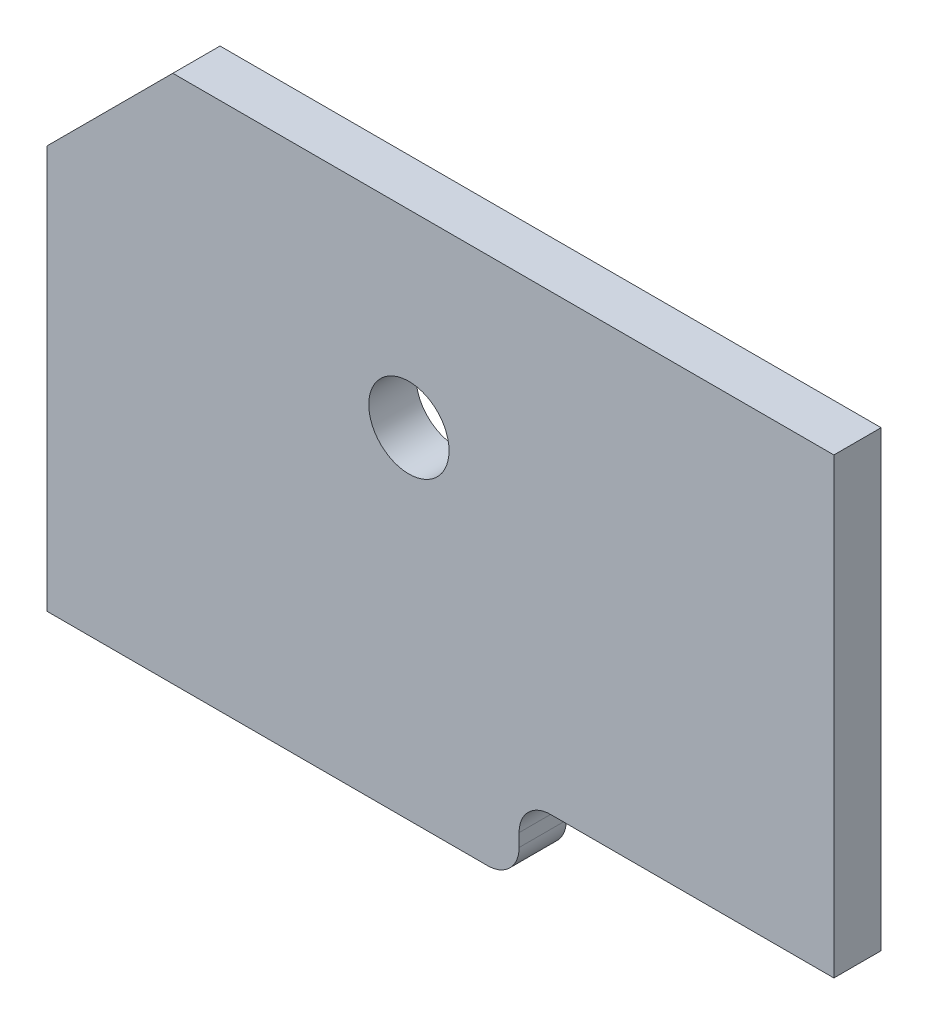
ISO-10303-21;
HEADER;
FILE_DESCRIPTION(('STEP AP214'),'2;1');
FILE_NAME('part.step','',(''),(''),'','','');
FILE_SCHEMA(('AUTOMOTIVE_DESIGN { 1 0 10303 214 1 1 1 1 }'));
ENDSEC;
DATA;
#1=APPLICATION_CONTEXT('core data for automotive mechanical design processes');
#2=APPLICATION_PROTOCOL_DEFINITION('international standard','automotive_design',2000,#1);
#3=PRODUCT_CONTEXT('',#1,'mechanical');
#4=PRODUCT('Part','Part','',(#3));
#5=PRODUCT_RELATED_PRODUCT_CATEGORY('part','',(#4));
#6=PRODUCT_DEFINITION_FORMATION('','',#4);
#7=PRODUCT_DEFINITION_CONTEXT('part definition',#1,'design');
#8=PRODUCT_DEFINITION('design','',#6,#7);
#9=PRODUCT_DEFINITION_SHAPE('','',#8);
#10=(LENGTH_UNIT() NAMED_UNIT(*) SI_UNIT(.MILLI.,.METRE.));
#11=(NAMED_UNIT(*) PLANE_ANGLE_UNIT() SI_UNIT($,.RADIAN.));
#12=(NAMED_UNIT(*) SI_UNIT($,.STERADIAN.) SOLID_ANGLE_UNIT());
#13=UNCERTAINTY_MEASURE_WITH_UNIT(LENGTH_MEASURE(1.E-05),#10,'distance_accuracy_value','');
#14=(GEOMETRIC_REPRESENTATION_CONTEXT(3) GLOBAL_UNCERTAINTY_ASSIGNED_CONTEXT((#13)) GLOBAL_UNIT_ASSIGNED_CONTEXT((#10,
#11,#12)) REPRESENTATION_CONTEXT('',''));
#15=CARTESIAN_POINT('',(0.,0.,0.));
#16=DIRECTION('',(0.,0.,1.));
#17=DIRECTION('',(1.,0.,0.));
#18=AXIS2_PLACEMENT_3D('',#15,#16,#17);
#19=CARTESIAN_POINT('',(953.73795010625,-945.50713318232,3.));
#20=DIRECTION('',(0.,0.,1.));
#21=DIRECTION('',(1.,0.,0.));
#22=AXIS2_PLACEMENT_3D('',#19,#20,#21);
#23=PLANE('',#22);
#24=CARTESIAN_POINT('',(953.73795010625,-945.50713318232,3.));
#25=DIRECTION('',(0.,0.,1.));
#26=DIRECTION('',(1.,0.,0.));
#27=AXIS2_PLACEMENT_3D('',#24,#25,#26);
#28=CIRCLE('',#27,1.99999999999995);
#29=CARTESIAN_POINT('',(953.737950106249,-947.50713318232,3.));
#30=VERTEX_POINT('',#29);
#31=CARTESIAN_POINT('',(955.737950106249,-945.50713318232,3.));
#32=VERTEX_POINT('',#31);
#33=EDGE_CURVE('E152',#30,#32,#28,.T.);
#34=ORIENTED_EDGE('',*,*,#33,.T.);
#35=DIRECTION('',(0.,1.,0.));
#36=VECTOR('',#35,1.);
#37=CARTESIAN_POINT('',(955.737950106249,-945.50713318232,3.));
#38=LINE('',#37,#36);
#39=CARTESIAN_POINT('',(955.737950106249,-944.686434413579,3.));
#40=VERTEX_POINT('',#39);
#41=EDGE_CURVE('E95',#32,#40,#38,.T.);
#42=ORIENTED_EDGE('',*,*,#41,.T.);
#43=CARTESIAN_POINT('',(957.737950106249,-944.686434413579,3.));
#44=DIRECTION('',(0.,0.,-1.));
#45=DIRECTION('',(-1.,0.,0.));
#46=AXIS2_PLACEMENT_3D('',#43,#44,#45);
#47=CIRCLE('',#46,2.);
#48=CARTESIAN_POINT('',(957.73795010625,-942.686434413579,3.));
#49=VERTEX_POINT('',#48);
#50=EDGE_CURVE('E170',#40,#49,#47,.T.);
#51=ORIENTED_EDGE('',*,*,#50,.T.);
#52=DIRECTION('',(1.,0.,0.));
#53=VECTOR('',#52,1.);
#54=CARTESIAN_POINT('',(957.73795010625,-942.686434413579,3.));
#55=LINE('',#54,#53);
#56=CARTESIAN_POINT('',(975.73795010625,-942.686434413579,3.));
#57=VERTEX_POINT('',#56);
#58=EDGE_CURVE('E187',#49,#57,#55,.T.);
#59=ORIENTED_EDGE('',*,*,#58,.T.);
#60=DIRECTION('',(0.,1.,0.));
#61=VECTOR('',#60,1.);
#62=CARTESIAN_POINT('',(975.73795010625,-942.686434413579,3.));
#63=LINE('',#62,#61);
#64=CARTESIAN_POINT('',(975.73795010625,-913.907133182434,3.));
#65=VERTEX_POINT('',#64);
#66=EDGE_CURVE('E186',#57,#65,#63,.T.);
#67=ORIENTED_EDGE('',*,*,#66,.T.);
#68=DIRECTION('',(-1.,0.,0.));
#69=VECTOR('',#68,1.);
#70=CARTESIAN_POINT('',(975.73795010625,-913.907133182434,3.));
#71=LINE('',#70,#69);
#72=CARTESIAN_POINT('',(933.737950106249,-913.907133182435,3.));
#73=VERTEX_POINT('',#72);
#74=EDGE_CURVE('E117',#65,#73,#71,.T.);
#75=ORIENTED_EDGE('',*,*,#74,.T.);
#76=DIRECTION('',(-0.707106781186543,-0.707106781186552,0.));
#77=VECTOR('',#76,1.);
#78=CARTESIAN_POINT('',(933.737950106249,-913.907133182435,3.));
#79=LINE('',#78,#77);
#80=CARTESIAN_POINT('',(925.737950106249,-921.907133182435,3.));
#81=VERTEX_POINT('',#80);
#82=EDGE_CURVE('E111',#73,#81,#79,.T.);
#83=ORIENTED_EDGE('',*,*,#82,.T.);
#84=DIRECTION('',(0.,-1.,0.));
#85=VECTOR('',#84,1.);
#86=CARTESIAN_POINT('',(925.737950106249,-921.907133182435,3.));
#87=LINE('',#86,#85);
#88=CARTESIAN_POINT('',(925.73795010625,-947.50713318232,3.));
#89=VERTEX_POINT('',#88);
#90=EDGE_CURVE('E115',#81,#89,#87,.T.);
#91=ORIENTED_EDGE('',*,*,#90,.T.);
#92=DIRECTION('',(1.,0.,0.));
#93=VECTOR('',#92,1.);
#94=CARTESIAN_POINT('',(925.73795010625,-947.50713318232,3.));
#95=LINE('',#94,#93);
#96=EDGE_CURVE('E49',#89,#30,#95,.T.);
#97=ORIENTED_EDGE('',*,*,#96,.T.);
#98=EDGE_LOOP('',(#34,#42,#51,#59,#67,#75,#83,#91,#97));
#99=FACE_BOUND('',#98,.T.);
#100=CARTESIAN_POINT('',(948.737950106249,-925.907133182437,3.));
#101=DIRECTION('',(0.,0.,1.));
#102=DIRECTION('',(1.,0.,0.));
#103=AXIS2_PLACEMENT_3D('',#100,#101,#102);
#104=CIRCLE('',#103,2.55000000000007);
#105=CARTESIAN_POINT('',(951.287950106249,-925.907133182437,3.));
#106=VERTEX_POINT('',#105);
#107=EDGE_CURVE('E139',#106,#106,#104,.T.);
#108=ORIENTED_EDGE('',*,*,#107,.F.);
#109=EDGE_LOOP('',(#108));
#110=FACE_BOUND('',#109,.T.);
#111=ADVANCED_FACE('F32',(#99,#110),#23,.T.);
#112=CARTESIAN_POINT('',(953.73795010625,-945.50713318232,0.));
#113=DIRECTION('',(0.,0.,1.));
#114=DIRECTION('',(1.,0.,0.));
#115=AXIS2_PLACEMENT_3D('',#112,#113,#114);
#116=PLANE('',#115);
#117=CARTESIAN_POINT('',(953.73795010625,-945.50713318232,0.));
#118=DIRECTION('',(0.,0.,1.));
#119=DIRECTION('',(1.,0.,0.));
#120=AXIS2_PLACEMENT_3D('',#117,#118,#119);
#121=CIRCLE('',#120,1.99999999999995);
#122=CARTESIAN_POINT('',(953.737950106249,-947.50713318232,0.));
#123=VERTEX_POINT('',#122);
#124=CARTESIAN_POINT('',(955.737950106249,-945.50713318232,0.));
#125=VERTEX_POINT('',#124);
#126=EDGE_CURVE('E135',#123,#125,#121,.T.);
#127=ORIENTED_EDGE('',*,*,#126,.F.);
#128=DIRECTION('',(1.,0.,0.));
#129=VECTOR('',#128,1.);
#130=CARTESIAN_POINT('',(925.73795010625,-947.50713318232,0.));
#131=LINE('',#130,#129);
#132=CARTESIAN_POINT('',(925.73795010625,-947.50713318232,0.));
#133=VERTEX_POINT('',#132);
#134=EDGE_CURVE('E87',#133,#123,#131,.T.);
#135=ORIENTED_EDGE('',*,*,#134,.F.);
#136=DIRECTION('',(0.,-1.,0.));
#137=VECTOR('',#136,1.);
#138=CARTESIAN_POINT('',(925.737950106249,-921.907133182435,0.));
#139=LINE('',#138,#137);
#140=CARTESIAN_POINT('',(925.737950106249,-921.907133182435,0.));
#141=VERTEX_POINT('',#140);
#142=EDGE_CURVE('E81',#141,#133,#139,.T.);
#143=ORIENTED_EDGE('',*,*,#142,.F.);
#144=DIRECTION('',(-0.707106781186543,-0.707106781186552,0.));
#145=VECTOR('',#144,1.);
#146=CARTESIAN_POINT('',(933.737950106249,-913.907133182435,0.));
#147=LINE('',#146,#145);
#148=CARTESIAN_POINT('',(933.737950106249,-913.907133182435,0.));
#149=VERTEX_POINT('',#148);
#150=EDGE_CURVE('E125',#149,#141,#147,.T.);
#151=ORIENTED_EDGE('',*,*,#150,.F.);
#152=DIRECTION('',(-1.,0.,0.));
#153=VECTOR('',#152,1.);
#154=CARTESIAN_POINT('',(975.73795010625,-913.907133182434,0.));
#155=LINE('',#154,#153);
#156=CARTESIAN_POINT('',(975.73795010625,-913.907133182434,0.));
#157=VERTEX_POINT('',#156);
#158=EDGE_CURVE('E147',#157,#149,#155,.T.);
#159=ORIENTED_EDGE('',*,*,#158,.F.);
#160=DIRECTION('',(0.,1.,0.));
#161=VECTOR('',#160,1.);
#162=CARTESIAN_POINT('',(975.73795010625,-942.686434413579,0.));
#163=LINE('',#162,#161);
#164=CARTESIAN_POINT('',(975.73795010625,-942.686434413579,0.));
#165=VERTEX_POINT('',#164);
#166=EDGE_CURVE('E145',#165,#157,#163,.T.);
#167=ORIENTED_EDGE('',*,*,#166,.F.);
#168=DIRECTION('',(1.,0.,0.));
#169=VECTOR('',#168,1.);
#170=CARTESIAN_POINT('',(957.73795010625,-942.686434413579,0.));
#171=LINE('',#170,#169);
#172=CARTESIAN_POINT('',(957.73795010625,-942.686434413579,0.));
#173=VERTEX_POINT('',#172);
#174=EDGE_CURVE('E143',#173,#165,#171,.T.);
#175=ORIENTED_EDGE('',*,*,#174,.F.);
#176=CARTESIAN_POINT('',(957.737950106249,-944.686434413579,0.));
#177=DIRECTION('',(0.,0.,-1.));
#178=DIRECTION('',(-1.,0.,0.));
#179=AXIS2_PLACEMENT_3D('',#176,#177,#178);
#180=CIRCLE('',#179,2.);
#181=CARTESIAN_POINT('',(955.737950106249,-944.686434413579,0.));
#182=VERTEX_POINT('',#181);
#183=EDGE_CURVE('E141',#182,#173,#180,.T.);
#184=ORIENTED_EDGE('',*,*,#183,.F.);
#185=DIRECTION('',(0.,1.,0.));
#186=VECTOR('',#185,1.);
#187=CARTESIAN_POINT('',(955.737950106249,-945.50713318232,0.));
#188=LINE('',#187,#186);
#189=EDGE_CURVE('E138',#125,#182,#188,.T.);
#190=ORIENTED_EDGE('',*,*,#189,.F.);
#191=EDGE_LOOP('',(#127,#135,#143,#151,#159,#167,#175,#184,#190));
#192=FACE_BOUND('',#191,.T.);
#193=CARTESIAN_POINT('',(948.737950106249,-925.907133182437,0.));
#194=DIRECTION('',(0.,0.,1.));
#195=DIRECTION('',(1.,0.,0.));
#196=AXIS2_PLACEMENT_3D('',#193,#194,#195);
#197=CIRCLE('',#196,2.55000000000007);
#198=CARTESIAN_POINT('',(951.287950106249,-925.907133182437,0.));
#199=VERTEX_POINT('',#198);
#200=EDGE_CURVE('E194',#199,#199,#197,.T.);
#201=ORIENTED_EDGE('',*,*,#200,.T.);
#202=EDGE_LOOP('',(#201));
#203=FACE_BOUND('',#202,.T.);
#204=ADVANCED_FACE('F174',(#192,#203),#116,.F.);
#205=CARTESIAN_POINT('',(953.73795010625,-945.50713318232,3.));
#206=DIRECTION('',(0.,0.,-1.));
#207=DIRECTION('',(-1.,0.,0.));
#208=AXIS2_PLACEMENT_3D('',#205,#206,#207);
#209=CYLINDRICAL_SURFACE('',#208,1.99999999999995);
#210=ORIENTED_EDGE('',*,*,#126,.T.);
#211=DIRECTION('',(0.,0.,-1.));
#212=VECTOR('',#211,1.);
#213=CARTESIAN_POINT('',(955.737950106249,-945.50713318232,3.));
#214=LINE('',#213,#212);
#215=EDGE_CURVE('E11',#32,#125,#214,.T.);
#216=ORIENTED_EDGE('',*,*,#215,.F.);
#217=ORIENTED_EDGE('',*,*,#33,.F.);
#218=DIRECTION('',(0.,0.,-1.));
#219=VECTOR('',#218,1.);
#220=CARTESIAN_POINT('',(953.737950106249,-947.50713318232,3.));
#221=LINE('',#220,#219);
#222=EDGE_CURVE('E131',#30,#123,#221,.T.);
#223=ORIENTED_EDGE('',*,*,#222,.T.);
#224=EDGE_LOOP('',(#210,#216,#217,#223));
#225=FACE_BOUND('',#224,.T.);
#226=ADVANCED_FACE('F34',(#225),#209,.T.);
#227=CARTESIAN_POINT('',(955.737950106249,-945.50713318232,3.));
#228=DIRECTION('',(-1.,0.,0.));
#229=DIRECTION('',(0.,0.,1.));
#230=AXIS2_PLACEMENT_3D('',#227,#228,#229);
#231=PLANE('',#230);
#232=ORIENTED_EDGE('',*,*,#189,.T.);
#233=DIRECTION('',(0.,0.,-1.));
#234=VECTOR('',#233,1.);
#235=CARTESIAN_POINT('',(955.737950106249,-944.686434413579,3.));
#236=LINE('',#235,#234);
#237=EDGE_CURVE('E41',#40,#182,#236,.T.);
#238=ORIENTED_EDGE('',*,*,#237,.F.);
#239=ORIENTED_EDGE('',*,*,#41,.F.);
#240=ORIENTED_EDGE('',*,*,#215,.T.);
#241=EDGE_LOOP('',(#232,#238,#239,#240));
#242=FACE_BOUND('',#241,.T.);
#243=ADVANCED_FACE('F226',(#242),#231,.F.);
#244=CARTESIAN_POINT('',(957.737950106249,-944.686434413579,3.));
#245=DIRECTION('',(0.,0.,-1.));
#246=DIRECTION('',(-1.,0.,0.));
#247=AXIS2_PLACEMENT_3D('',#244,#245,#246);
#248=CYLINDRICAL_SURFACE('',#247,2.);
#249=ORIENTED_EDGE('',*,*,#183,.T.);
#250=DIRECTION('',(0.,0.,-1.));
#251=VECTOR('',#250,1.);
#252=CARTESIAN_POINT('',(957.73795010625,-942.686434413579,3.));
#253=LINE('',#252,#251);
#254=EDGE_CURVE('E162',#49,#173,#253,.T.);
#255=ORIENTED_EDGE('',*,*,#254,.F.);
#256=ORIENTED_EDGE('',*,*,#50,.F.);
#257=ORIENTED_EDGE('',*,*,#237,.T.);
#258=EDGE_LOOP('',(#249,#255,#256,#257));
#259=FACE_BOUND('',#258,.T.);
#260=ADVANCED_FACE('F168',(#259),#248,.F.);
#261=CARTESIAN_POINT('',(957.73795010625,-942.686434413579,3.));
#262=DIRECTION('',(0.,1.,0.));
#263=DIRECTION('',(-1.,0.,0.));
#264=AXIS2_PLACEMENT_3D('',#261,#262,#263);
#265=PLANE('',#264);
#266=ORIENTED_EDGE('',*,*,#174,.T.);
#267=DIRECTION('',(0.,0.,-1.));
#268=VECTOR('',#267,1.);
#269=CARTESIAN_POINT('',(975.73795010625,-942.686434413579,3.));
#270=LINE('',#269,#268);
#271=EDGE_CURVE('E159',#57,#165,#270,.T.);
#272=ORIENTED_EDGE('',*,*,#271,.F.);
#273=ORIENTED_EDGE('',*,*,#58,.F.);
#274=ORIENTED_EDGE('',*,*,#254,.T.);
#275=EDGE_LOOP('',(#266,#272,#273,#274));
#276=FACE_BOUND('',#275,.T.);
#277=ADVANCED_FACE('F180',(#276),#265,.F.);
#278=CARTESIAN_POINT('',(975.73795010625,-942.686434413579,3.));
#279=DIRECTION('',(-1.,0.,0.));
#280=DIRECTION('',(0.,-1.,0.));
#281=AXIS2_PLACEMENT_3D('',#278,#279,#280);
#282=PLANE('',#281);
#283=ORIENTED_EDGE('',*,*,#166,.T.);
#284=DIRECTION('',(0.,0.,-1.));
#285=VECTOR('',#284,1.);
#286=CARTESIAN_POINT('',(975.73795010625,-913.907133182434,3.));
#287=LINE('',#286,#285);
#288=EDGE_CURVE('E156',#65,#157,#287,.T.);
#289=ORIENTED_EDGE('',*,*,#288,.F.);
#290=ORIENTED_EDGE('',*,*,#66,.F.);
#291=ORIENTED_EDGE('',*,*,#271,.T.);
#292=EDGE_LOOP('',(#283,#289,#290,#291));
#293=FACE_BOUND('',#292,.T.);
#294=ADVANCED_FACE('F184',(#293),#282,.F.);
#295=CARTESIAN_POINT('',(975.73795010625,-913.907133182434,3.));
#296=DIRECTION('',(0.,-1.,0.));
#297=DIRECTION('',(1.,0.,0.));
#298=AXIS2_PLACEMENT_3D('',#295,#296,#297);
#299=PLANE('',#298);
#300=ORIENTED_EDGE('',*,*,#158,.T.);
#301=DIRECTION('',(0.,0.,-1.));
#302=VECTOR('',#301,1.);
#303=CARTESIAN_POINT('',(933.737950106249,-913.907133182435,3.));
#304=LINE('',#303,#302);
#305=EDGE_CURVE('E126',#73,#149,#304,.T.);
#306=ORIENTED_EDGE('',*,*,#305,.F.);
#307=ORIENTED_EDGE('',*,*,#74,.F.);
#308=ORIENTED_EDGE('',*,*,#288,.T.);
#309=EDGE_LOOP('',(#300,#306,#307,#308));
#310=FACE_BOUND('',#309,.T.);
#311=ADVANCED_FACE('F217',(#310),#299,.F.);
#312=CARTESIAN_POINT('',(933.737950106249,-913.907133182435,3.));
#313=DIRECTION('',(0.707106781186552,-0.707106781186543,0.));
#314=DIRECTION('',(0.707106781186543,0.707106781186552,0.));
#315=AXIS2_PLACEMENT_3D('',#312,#313,#314);
#316=PLANE('',#315);
#317=ORIENTED_EDGE('',*,*,#150,.T.);
#318=DIRECTION('',(0.,0.,-1.));
#319=VECTOR('',#318,1.);
#320=CARTESIAN_POINT('',(925.737950106249,-921.907133182435,3.));
#321=LINE('',#320,#319);
#322=EDGE_CURVE('E122',#81,#141,#321,.T.);
#323=ORIENTED_EDGE('',*,*,#322,.F.);
#324=ORIENTED_EDGE('',*,*,#82,.F.);
#325=ORIENTED_EDGE('',*,*,#305,.T.);
#326=EDGE_LOOP('',(#317,#323,#324,#325));
#327=FACE_BOUND('',#326,.T.);
#328=ADVANCED_FACE('F123',(#327),#316,.F.);
#329=CARTESIAN_POINT('',(925.737950106249,-921.907133182435,3.));
#330=DIRECTION('',(1.,0.,0.));
#331=DIRECTION('',(0.,1.,0.));
#332=AXIS2_PLACEMENT_3D('',#329,#330,#331);
#333=PLANE('',#332);
#334=ORIENTED_EDGE('',*,*,#142,.T.);
#335=DIRECTION('',(0.,0.,-1.));
#336=VECTOR('',#335,1.);
#337=CARTESIAN_POINT('',(925.73795010625,-947.50713318232,3.));
#338=LINE('',#337,#336);
#339=EDGE_CURVE('E127',#89,#133,#338,.T.);
#340=ORIENTED_EDGE('',*,*,#339,.F.);
#341=ORIENTED_EDGE('',*,*,#90,.F.);
#342=ORIENTED_EDGE('',*,*,#322,.T.);
#343=EDGE_LOOP('',(#334,#340,#341,#342));
#344=FACE_BOUND('',#343,.T.);
#345=ADVANCED_FACE('F129',(#344),#333,.F.);
#346=CARTESIAN_POINT('',(925.73795010625,-947.50713318232,3.));
#347=DIRECTION('',(0.,1.,0.));
#348=DIRECTION('',(-1.,0.,0.));
#349=AXIS2_PLACEMENT_3D('',#346,#347,#348);
#350=PLANE('',#349);
#351=ORIENTED_EDGE('',*,*,#134,.T.);
#352=ORIENTED_EDGE('',*,*,#222,.F.);
#353=ORIENTED_EDGE('',*,*,#96,.F.);
#354=ORIENTED_EDGE('',*,*,#339,.T.);
#355=EDGE_LOOP('',(#351,#352,#353,#354));
#356=FACE_BOUND('',#355,.T.);
#357=ADVANCED_FACE('F210',(#356),#350,.F.);
#358=CARTESIAN_POINT('',(948.737950106249,-925.907133182437,3.));
#359=DIRECTION('',(0.,0.,-1.));
#360=DIRECTION('',(-1.,0.,0.));
#361=AXIS2_PLACEMENT_3D('',#358,#359,#360);
#362=CYLINDRICAL_SURFACE('',#361,2.55000000000007);
#363=ORIENTED_EDGE('',*,*,#107,.T.);
#364=EDGE_LOOP('',(#363));
#365=FACE_BOUND('',#364,.T.);
#366=ORIENTED_EDGE('',*,*,#200,.F.);
#367=EDGE_LOOP('',(#366));
#368=FACE_BOUND('',#367,.T.);
#369=ADVANCED_FACE('F200',(#365,#368),#362,.F.);
#370=CLOSED_SHELL('',(#111,#204,#226,#243,#260,#277,#294,#311,#328,#345,#357,#369));
#371=MANIFOLD_SOLID_BREP('B2',#370);
#372=ADVANCED_BREP_SHAPE_REPRESENTATION('',(#18,#371),#14);
#373=SHAPE_DEFINITION_REPRESENTATION(#9,#372);
ENDSEC;
END-ISO-10303-21;
